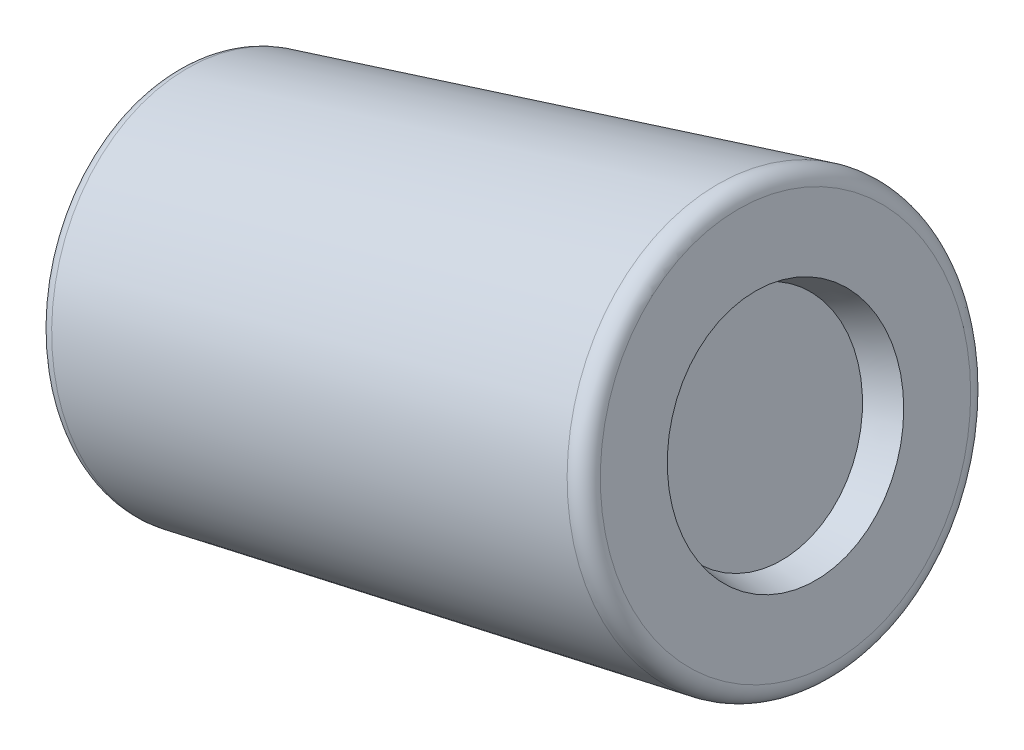
ISO-10303-21;
HEADER;
FILE_DESCRIPTION(('STEP AP214'),'2;1');
FILE_NAME('part.step','',(''),(''),'','','');
FILE_SCHEMA(('AUTOMOTIVE_DESIGN { 1 0 10303 214 1 1 1 1 }'));
ENDSEC;
DATA;
#1=APPLICATION_CONTEXT('core data for automotive mechanical design processes');
#2=APPLICATION_PROTOCOL_DEFINITION('international standard','automotive_design',2000,#1);
#3=PRODUCT_CONTEXT('',#1,'mechanical');
#4=PRODUCT('Part','Part','',(#3));
#5=PRODUCT_RELATED_PRODUCT_CATEGORY('part','',(#4));
#6=PRODUCT_DEFINITION_FORMATION('','',#4);
#7=PRODUCT_DEFINITION_CONTEXT('part definition',#1,'design');
#8=PRODUCT_DEFINITION('design','',#6,#7);
#9=PRODUCT_DEFINITION_SHAPE('','',#8);
#10=(LENGTH_UNIT() NAMED_UNIT(*) SI_UNIT(.MILLI.,.METRE.));
#11=(NAMED_UNIT(*) PLANE_ANGLE_UNIT() SI_UNIT($,.RADIAN.));
#12=(NAMED_UNIT(*) SI_UNIT($,.STERADIAN.) SOLID_ANGLE_UNIT());
#13=UNCERTAINTY_MEASURE_WITH_UNIT(LENGTH_MEASURE(1.E-05),#10,'distance_accuracy_value','');
#14=(GEOMETRIC_REPRESENTATION_CONTEXT(3) GLOBAL_UNCERTAINTY_ASSIGNED_CONTEXT((#13)) GLOBAL_UNIT_ASSIGNED_CONTEXT((#10,
#11,#12)) REPRESENTATION_CONTEXT('',''));
#15=CARTESIAN_POINT('',(0.,0.,0.));
#16=DIRECTION('',(0.,0.,1.));
#17=DIRECTION('',(1.,0.,0.));
#18=AXIS2_PLACEMENT_3D('',#15,#16,#17);
#19=CARTESIAN_POINT('',(-4.68392731255826,22.1190357157242,0.));
#20=DIRECTION('',(0.964787323828813,0.263031214457976,0.));
#21=DIRECTION('',(-0.263031214457976,0.964787323828813,0.));
#22=AXIS2_PLACEMENT_3D('',#19,#20,#21);
#23=PLANE('',#22);
#24=CARTESIAN_POINT('',(-3.89483366918433,19.2246737442378,0.));
#25=DIRECTION('',(0.964787323828813,0.263031214457976,0.));
#26=DIRECTION('',(-0.263031214457976,0.964787323828813,0.));
#27=AXIS2_PLACEMENT_3D('',#24,#25,#26);
#28=CIRCLE('',#27,2.74097437975247);
#29=CARTESIAN_POINT('',(-4.61579548908882,21.8691310807625,0.));
#30=VERTEX_POINT('',#29);
#31=EDGE_CURVE('E10',#30,#30,#28,.T.);
#32=ORIENTED_EDGE('',*,*,#31,.T.);
#33=EDGE_LOOP('',(#32));
#34=FACE_BOUND('',#33,.T.);
#35=CARTESIAN_POINT('',(-3.89483366918434,19.2246737442378,0.));
#36=DIRECTION('',(0.964787323828813,0.263031214457976,0.));
#37=DIRECTION('',(-0.263031214457976,0.964787323828813,0.));
#38=AXIS2_PLACEMENT_3D('',#35,#36,#37);
#39=CIRCLE('',#38,1.75);
#40=CARTESIAN_POINT('',(-4.3551382944858,20.9130515609382,0.));
#41=VERTEX_POINT('',#40);
#42=EDGE_CURVE('E53',#41,#41,#39,.T.);
#43=ORIENTED_EDGE('',*,*,#42,.F.);
#44=EDGE_LOOP('',(#43));
#45=FACE_BOUND('',#44,.T.);
#46=ADVANCED_FACE('F31',(#34,#45),#23,.T.);
#47=CARTESIAN_POINT('',(-13.2830375002004,19.4437353860437,0.));
#48=DIRECTION('',(-0.964787323828813,-0.263031214457976,0.));
#49=DIRECTION('',(0.263031214457976,-0.964787323828813,0.));
#50=AXIS2_PLACEMENT_3D('',#47,#48,#49);
#51=PLANE('',#50);
#52=CARTESIAN_POINT('',(-12.5779195836436,16.857392814116,0.));
#53=DIRECTION('',(-0.964787323828813,-0.263031214457976,0.));
#54=DIRECTION('',(0.263031214457976,-0.964787323828813,0.));
#55=AXIS2_PLACEMENT_3D('',#52,#53,#54);
#56=CIRCLE('',#55,2.43944967735496);
#57=CARTESIAN_POINT('',(-11.9362681723999,14.5038426882857,0.));
#58=VERTEX_POINT('',#57);
#59=EDGE_CURVE('E37',#58,#58,#56,.T.);
#60=ORIENTED_EDGE('',*,*,#59,.T.);
#61=EDGE_LOOP('',(#60));
#62=FACE_BOUND('',#61,.T.);
#63=ADVANCED_FACE('F60',(#62),#51,.T.);
#64=CARTESIAN_POINT('',(-3.89483366918434,19.2246737442378,0.));
#65=DIRECTION('',(0.964787323828813,0.263031214457976,0.));
#66=DIRECTION('',(-0.263031214457976,0.964787323828813,0.));
#67=AXIS2_PLACEMENT_3D('',#64,#65,#66);
#68=CONICAL_SURFACE('',#67,3.,0.0354586260444339);
#69=CARTESIAN_POINT('',(-12.3452734688328,16.9208194249413,0.));
#70=DIRECTION('',(-0.964787323828813,-0.263031214457976,0.));
#71=DIRECTION('',(0.263031214457976,-0.964787323828813,0.));
#72=AXIS2_PLACEMENT_3D('',#69,#70,#71);
#73=CIRCLE('',#72,2.68929252955122);
#74=CARTESIAN_POINT('',(-11.6379055887522,14.3262240823627,0.));
#75=VERTEX_POINT('',#74);
#76=EDGE_CURVE('E41',#75,#75,#73,.F.);
#77=ORIENTED_EDGE('',*,*,#76,.T.);
#78=EDGE_LOOP('',(#77));
#79=FACE_BOUND('',#78,.T.);
#80=CARTESIAN_POINT('',(-4.14458121628793,19.1565847478341,0.));
#81=DIRECTION('',(-0.964787323828813,-0.263031214457976,0.));
#82=DIRECTION('',(0.263031214457976,-0.964787323828813,0.));
#83=AXIS2_PLACEMENT_3D('',#80,#81,#82);
#84=CIRCLE('',#83,2.99081723194873);
#85=CARTESIAN_POINT('',(-3.35790292754661,16.2710821945611,0.));
#86=VERTEX_POINT('',#85);
#87=EDGE_CURVE('E45',#86,#86,#84,.T.);
#88=ORIENTED_EDGE('',*,*,#87,.T.);
#89=EDGE_LOOP('',(#88));
#90=FACE_BOUND('',#89,.T.);
#91=ADVANCED_FACE('F64',(#79,#90),#68,.T.);
#92=CARTESIAN_POINT('',(-3.89483366918434,19.2246737442378,0.));
#93=DIRECTION('',(0.964787323828813,0.263031214457976,0.));
#94=DIRECTION('',(-0.263031214457976,0.964787323828813,0.));
#95=AXIS2_PLACEMENT_3D('',#92,#93,#94);
#96=CONICAL_SURFACE('',#95,1.75,0.279252680319093);
#97=CARTESIAN_POINT('',(-4.37722733109874,19.0931581370088,0.));
#98=DIRECTION('',(0.964787323828813,0.263031214457976,0.));
#99=DIRECTION('',(-0.263031214457976,0.964787323828813,0.));
#100=AXIS2_PLACEMENT_3D('',#97,#98,#99);
#101=CIRCLE('',#100,1.6066273071206);
#102=CARTESIAN_POINT('',(-4.79982046287202,20.643211797036,0.));
#103=VERTEX_POINT('',#102);
#104=EDGE_CURVE('E50',#103,#103,#101,.T.);
#105=ORIENTED_EDGE('',*,*,#104,.F.);
#106=EDGE_LOOP('',(#105));
#107=FACE_BOUND('',#106,.T.);
#108=ORIENTED_EDGE('',*,*,#42,.T.);
#109=EDGE_LOOP('',(#108));
#110=FACE_BOUND('',#109,.T.);
#111=ADVANCED_FACE('F57',(#107,#110),#96,.F.);
#112=CARTESIAN_POINT('',(-4.37722733109874,19.0931581370088,0.));
#113=DIRECTION('',(0.964787323828813,0.263031214457976,0.));
#114=DIRECTION('',(-0.263031214457976,0.964787323828813,0.));
#115=AXIS2_PLACEMENT_3D('',#112,#113,#114);
#116=PLANE('',#115);
#117=ORIENTED_EDGE('',*,*,#104,.T.);
#118=EDGE_LOOP('',(#117));
#119=FACE_BOUND('',#118,.T.);
#120=ADVANCED_FACE('F73',(#119),#116,.T.);
#121=CARTESIAN_POINT('',(-12.3367227526864,16.9231506177305,0.));
#122=DIRECTION('',(-0.964787323828813,-0.263031214457976,0.));
#123=DIRECTION('',(0.263031214457976,-0.964787323828813,0.));
#124=AXIS2_PLACEMENT_3D('',#121,#122,#123);
#125=TOROIDAL_SURFACE('',#124,2.43944967735496,0.25);
#126=ORIENTED_EDGE('',*,*,#59,.F.);
#127=EDGE_LOOP('',(#126));
#128=FACE_BOUND('',#127,.T.);
#129=ORIENTED_EDGE('',*,*,#76,.F.);
#130=EDGE_LOOP('',(#129));
#131=FACE_BOUND('',#130,.T.);
#132=ADVANCED_FACE('F77',(#128,#131),#125,.T.);
#133=CARTESIAN_POINT('',(-4.13603050014154,19.1589159406233,0.));
#134=DIRECTION('',(0.964787323828813,0.263031214457976,0.));
#135=DIRECTION('',(-0.263031214457976,0.964787323828813,0.));
#136=AXIS2_PLACEMENT_3D('',#133,#134,#135);
#137=TOROIDAL_SURFACE('',#136,2.74097437975247,0.25);
#138=ORIENTED_EDGE('',*,*,#87,.F.);
#139=EDGE_LOOP('',(#138));
#140=FACE_BOUND('',#139,.T.);
#141=ORIENTED_EDGE('',*,*,#31,.F.);
#142=EDGE_LOOP('',(#141));
#143=FACE_BOUND('',#142,.T.);
#144=ADVANCED_FACE('F81',(#140,#143),#137,.T.);
#145=CLOSED_SHELL('',(#46,#63,#91,#111,#120,#132,#144));
#146=MANIFOLD_SOLID_BREP('B2',#145);
#147=ADVANCED_BREP_SHAPE_REPRESENTATION('',(#18,#146),#14);
#148=SHAPE_DEFINITION_REPRESENTATION(#9,#147);
ENDSEC;
END-ISO-10303-21;
